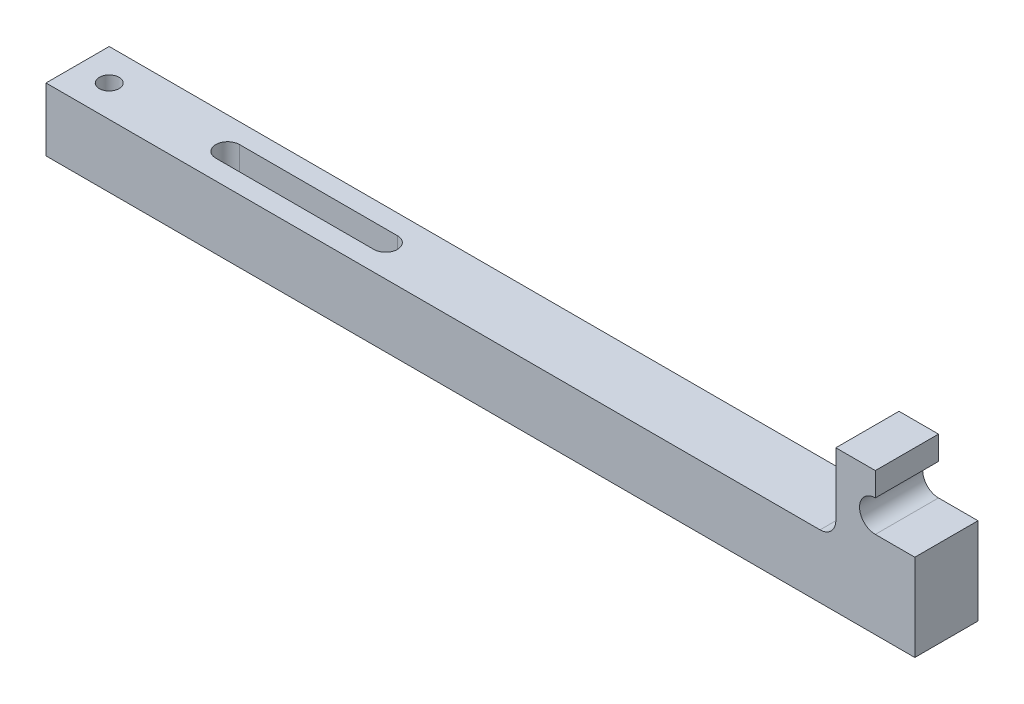
ISO-10303-21;
HEADER;
FILE_DESCRIPTION(('STEP AP214'),'2;1');
FILE_NAME('part.step','',(''),(''),'','','');
FILE_SCHEMA(('AUTOMOTIVE_DESIGN { 1 0 10303 214 1 1 1 1 }'));
ENDSEC;
DATA;
#1=APPLICATION_CONTEXT('core data for automotive mechanical design processes');
#2=APPLICATION_PROTOCOL_DEFINITION('international standard','automotive_design',2000,#1);
#3=PRODUCT_CONTEXT('',#1,'mechanical');
#4=PRODUCT('Part','Part','',(#3));
#5=PRODUCT_RELATED_PRODUCT_CATEGORY('part','',(#4));
#6=PRODUCT_DEFINITION_FORMATION('','',#4);
#7=PRODUCT_DEFINITION_CONTEXT('part definition',#1,'design');
#8=PRODUCT_DEFINITION('design','',#6,#7);
#9=PRODUCT_DEFINITION_SHAPE('','',#8);
#10=(LENGTH_UNIT() NAMED_UNIT(*) SI_UNIT(.MILLI.,.METRE.));
#11=(NAMED_UNIT(*) PLANE_ANGLE_UNIT() SI_UNIT($,.RADIAN.));
#12=(NAMED_UNIT(*) SI_UNIT($,.STERADIAN.) SOLID_ANGLE_UNIT());
#13=UNCERTAINTY_MEASURE_WITH_UNIT(LENGTH_MEASURE(1.E-05),#10,'distance_accuracy_value','');
#14=(GEOMETRIC_REPRESENTATION_CONTEXT(3) GLOBAL_UNCERTAINTY_ASSIGNED_CONTEXT((#13)) GLOBAL_UNIT_ASSIGNED_CONTEXT((#10,
#11,#12)) REPRESENTATION_CONTEXT('',''));
#15=CARTESIAN_POINT('',(0.,0.,0.));
#16=DIRECTION('',(0.,0.,1.));
#17=DIRECTION('',(1.,0.,0.));
#18=AXIS2_PLACEMENT_3D('',#15,#16,#17);
#19=CARTESIAN_POINT('',(-36.5317519078392,6.05177560888821,8.));
#20=DIRECTION('',(0.,0.,-1.));
#21=DIRECTION('',(-1.,0.,0.));
#22=AXIS2_PLACEMENT_3D('',#19,#20,#21);
#23=CYLINDRICAL_SURFACE('',#22,2.);
#24=CARTESIAN_POINT('',(-36.5317519078392,6.05177560888821,0.));
#25=DIRECTION('',(0.,0.,-1.));
#26=DIRECTION('',(1.,0.,0.));
#27=AXIS2_PLACEMENT_3D('',#24,#25,#26);
#28=CIRCLE('',#27,2.);
#29=CARTESIAN_POINT('',(-34.5317519078392,6.05177560888821,0.));
#30=VERTEX_POINT('',#29);
#31=CARTESIAN_POINT('',(-36.5317519078392,4.05177560888821,0.));
#32=VERTEX_POINT('',#31);
#33=EDGE_CURVE('E173',#30,#32,#28,.T.);
#34=ORIENTED_EDGE('',*,*,#33,.T.);
#35=DIRECTION('',(0.,0.,-1.));
#36=VECTOR('',#35,1.);
#37=CARTESIAN_POINT('',(-36.5317519078392,4.05177560888821,8.));
#38=LINE('',#37,#36);
#39=CARTESIAN_POINT('',(-36.5317519078392,4.05177560888821,8.));
#40=VERTEX_POINT('',#39);
#41=EDGE_CURVE('E11',#40,#32,#38,.T.);
#42=ORIENTED_EDGE('',*,*,#41,.F.);
#43=CARTESIAN_POINT('',(-36.5317519078392,6.05177560888821,8.));
#44=DIRECTION('',(0.,0.,-1.));
#45=DIRECTION('',(1.,0.,0.));
#46=AXIS2_PLACEMENT_3D('',#43,#44,#45);
#47=CIRCLE('',#46,2.);
#48=CARTESIAN_POINT('',(-34.5317519078392,6.05177560888821,8.));
#49=VERTEX_POINT('',#48);
#50=EDGE_CURVE('E176',#49,#40,#47,.T.);
#51=ORIENTED_EDGE('',*,*,#50,.F.);
#52=DIRECTION('',(0.,0.,-1.));
#53=VECTOR('',#52,1.);
#54=CARTESIAN_POINT('',(-34.5317519078392,6.05177560888821,8.));
#55=LINE('',#54,#53);
#56=EDGE_CURVE('E198',#49,#30,#55,.T.);
#57=ORIENTED_EDGE('',*,*,#56,.T.);
#58=EDGE_LOOP('',(#34,#42,#51,#57));
#59=FACE_BOUND('',#58,.T.);
#60=ADVANCED_FACE('F33',(#59),#23,.F.);
#61=CARTESIAN_POINT('',(-134.531751907839,4.05177560888821,8.));
#62=DIRECTION('',(0.,-1.,0.));
#63=DIRECTION('',(0.,0.,-1.));
#64=AXIS2_PLACEMENT_3D('',#61,#62,#63);
#65=PLANE('',#64);
#66=DIRECTION('',(1.,0.,0.));
#67=VECTOR('',#66,1.);
#68=CARTESIAN_POINT('',(-115.531751907839,4.05177560888821,5.5));
#69=LINE('',#68,#67);
#70=CARTESIAN_POINT('',(-115.531751907839,4.05177560888821,5.5));
#71=VERTEX_POINT('',#70);
#72=CARTESIAN_POINT('',(-95.5317519078392,4.05177560888821,5.5));
#73=VERTEX_POINT('',#72);
#74=EDGE_CURVE('E160',#71,#73,#69,.T.);
#75=ORIENTED_EDGE('',*,*,#74,.F.);
#76=CARTESIAN_POINT('',(-115.531751907839,4.05177560888821,4.));
#77=DIRECTION('',(0.,1.,0.));
#78=DIRECTION('',(0.,0.,1.));
#79=AXIS2_PLACEMENT_3D('',#76,#77,#78);
#80=CIRCLE('',#79,1.5);
#81=CARTESIAN_POINT('',(-115.531751907839,4.05177560888821,2.5));
#82=VERTEX_POINT('',#81);
#83=EDGE_CURVE('E47',#82,#71,#80,.T.);
#84=ORIENTED_EDGE('',*,*,#83,.F.);
#85=DIRECTION('',(-1.,0.,0.));
#86=VECTOR('',#85,1.);
#87=CARTESIAN_POINT('',(-115.531751907839,4.05177560888821,2.5));
#88=LINE('',#87,#86);
#89=CARTESIAN_POINT('',(-95.5317519078392,4.05177560888821,2.5));
#90=VERTEX_POINT('',#89);
#91=EDGE_CURVE('E151',#90,#82,#88,.T.);
#92=ORIENTED_EDGE('',*,*,#91,.F.);
#93=CARTESIAN_POINT('',(-95.5317519078392,4.05177560888821,4.));
#94=DIRECTION('',(0.,1.,0.));
#95=DIRECTION('',(0.,0.,1.));
#96=AXIS2_PLACEMENT_3D('',#93,#94,#95);
#97=CIRCLE('',#96,1.5);
#98=EDGE_CURVE('E154',#73,#90,#97,.T.);
#99=ORIENTED_EDGE('',*,*,#98,.F.);
#100=EDGE_LOOP('',(#75,#84,#92,#99));
#101=FACE_BOUND('',#100,.T.);
#102=CARTESIAN_POINT('',(-130.531751907839,4.05177560888821,4.));
#103=DIRECTION('',(0.,1.,0.));
#104=DIRECTION('',(0.,0.,1.));
#105=AXIS2_PLACEMENT_3D('',#102,#103,#104);
#106=CIRCLE('',#105,1.25000000000001);
#107=CARTESIAN_POINT('',(-130.531751907839,4.05177560888821,5.25000000000001));
#108=VERTEX_POINT('',#107);
#109=EDGE_CURVE('E166',#108,#108,#106,.T.);
#110=ORIENTED_EDGE('',*,*,#109,.F.);
#111=EDGE_LOOP('',(#110));
#112=FACE_BOUND('',#111,.T.);
#113=DIRECTION('',(-1.,0.,0.));
#114=VECTOR('',#113,1.);
#115=CARTESIAN_POINT('',(-134.531751907839,4.05177560888821,0.));
#116=LINE('',#115,#114);
#117=CARTESIAN_POINT('',(-134.531751907839,4.05177560888821,0.));
#118=VERTEX_POINT('',#117);
#119=EDGE_CURVE('E201',#32,#118,#116,.T.);
#120=ORIENTED_EDGE('',*,*,#119,.T.);
#121=DIRECTION('',(0.,0.,-1.));
#122=VECTOR('',#121,1.);
#123=CARTESIAN_POINT('',(-134.531751907839,4.05177560888821,8.));
#124=LINE('',#123,#122);
#125=CARTESIAN_POINT('',(-134.531751907839,4.05177560888821,8.));
#126=VERTEX_POINT('',#125);
#127=EDGE_CURVE('E40',#126,#118,#124,.T.);
#128=ORIENTED_EDGE('',*,*,#127,.F.);
#129=DIRECTION('',(-1.,0.,0.));
#130=VECTOR('',#129,1.);
#131=CARTESIAN_POINT('',(-134.531751907839,4.05177560888821,8.));
#132=LINE('',#131,#130);
#133=EDGE_CURVE('E179',#40,#126,#132,.T.);
#134=ORIENTED_EDGE('',*,*,#133,.F.);
#135=ORIENTED_EDGE('',*,*,#41,.T.);
#136=EDGE_LOOP('',(#120,#128,#134,#135));
#137=FACE_BOUND('',#136,.T.);
#138=ADVANCED_FACE('F267',(#101,#112,#137),#65,.F.);
#139=CARTESIAN_POINT('',(-134.531751907839,-3.9482243911118,8.));
#140=DIRECTION('',(1.,0.,0.));
#141=DIRECTION('',(0.,0.,-1.));
#142=AXIS2_PLACEMENT_3D('',#139,#140,#141);
#143=PLANE('',#142);
#144=DIRECTION('',(0.,-1.,0.));
#145=VECTOR('',#144,1.);
#146=CARTESIAN_POINT('',(-134.531751907839,-3.9482243911118,0.));
#147=LINE('',#146,#145);
#148=CARTESIAN_POINT('',(-134.531751907839,-3.9482243911118,0.));
#149=VERTEX_POINT('',#148);
#150=EDGE_CURVE('E203',#118,#149,#147,.T.);
#151=ORIENTED_EDGE('',*,*,#150,.T.);
#152=DIRECTION('',(0.,0.,-1.));
#153=VECTOR('',#152,1.);
#154=CARTESIAN_POINT('',(-134.531751907839,-3.9482243911118,8.));
#155=LINE('',#154,#153);
#156=CARTESIAN_POINT('',(-134.531751907839,-3.9482243911118,8.));
#157=VERTEX_POINT('',#156);
#158=EDGE_CURVE('E238',#157,#149,#155,.T.);
#159=ORIENTED_EDGE('',*,*,#158,.F.);
#160=DIRECTION('',(0.,-1.,0.));
#161=VECTOR('',#160,1.);
#162=CARTESIAN_POINT('',(-134.531751907839,-3.9482243911118,8.));
#163=LINE('',#162,#161);
#164=EDGE_CURVE('E182',#126,#157,#163,.T.);
#165=ORIENTED_EDGE('',*,*,#164,.F.);
#166=ORIENTED_EDGE('',*,*,#127,.T.);
#167=EDGE_LOOP('',(#151,#159,#165,#166));
#168=FACE_BOUND('',#167,.T.);
#169=ADVANCED_FACE('F245',(#168),#143,.F.);
#170=CARTESIAN_POINT('',(-24.5317519078392,-3.94822439111179,8.));
#171=DIRECTION('',(0.,1.,0.));
#172=DIRECTION('',(-1.,0.,0.));
#173=AXIS2_PLACEMENT_3D('',#170,#171,#172);
#174=PLANE('',#173);
#175=DIRECTION('',(-1.,0.,0.));
#176=VECTOR('',#175,1.);
#177=CARTESIAN_POINT('',(-115.531751907839,-3.94822439111179,2.5));
#178=LINE('',#177,#176);
#179=CARTESIAN_POINT('',(-95.5317519078392,-3.94822439111179,2.5));
#180=VERTEX_POINT('',#179);
#181=CARTESIAN_POINT('',(-115.531751907839,-3.94822439111179,2.5));
#182=VERTEX_POINT('',#181);
#183=EDGE_CURVE('E141',#180,#182,#178,.T.);
#184=ORIENTED_EDGE('',*,*,#183,.T.);
#185=CARTESIAN_POINT('',(-115.531751907839,-3.94822439111179,4.));
#186=DIRECTION('',(0.,1.,0.));
#187=DIRECTION('',(0.,0.,1.));
#188=AXIS2_PLACEMENT_3D('',#185,#186,#187);
#189=CIRCLE('',#188,1.5);
#190=CARTESIAN_POINT('',(-115.531751907839,-3.94822439111179,5.5));
#191=VERTEX_POINT('',#190);
#192=EDGE_CURVE('E135',#182,#191,#189,.T.);
#193=ORIENTED_EDGE('',*,*,#192,.T.);
#194=DIRECTION('',(1.,0.,0.));
#195=VECTOR('',#194,1.);
#196=CARTESIAN_POINT('',(-115.531751907839,-3.94822439111179,5.5));
#197=LINE('',#196,#195);
#198=CARTESIAN_POINT('',(-95.5317519078392,-3.9482243911118,5.5));
#199=VERTEX_POINT('',#198);
#200=EDGE_CURVE('E144',#191,#199,#197,.T.);
#201=ORIENTED_EDGE('',*,*,#200,.T.);
#202=CARTESIAN_POINT('',(-95.5317519078392,-3.94822439111179,4.));
#203=DIRECTION('',(0.,1.,0.));
#204=DIRECTION('',(0.,0.,1.));
#205=AXIS2_PLACEMENT_3D('',#202,#203,#204);
#206=CIRCLE('',#205,1.5);
#207=EDGE_CURVE('E55',#199,#180,#206,.T.);
#208=ORIENTED_EDGE('',*,*,#207,.T.);
#209=EDGE_LOOP('',(#184,#193,#201,#208));
#210=FACE_BOUND('',#209,.T.);
#211=CARTESIAN_POINT('',(-130.531751907839,-3.94822439111179,4.));
#212=DIRECTION('',(0.,1.,0.));
#213=DIRECTION('',(0.,0.,1.));
#214=AXIS2_PLACEMENT_3D('',#211,#212,#213);
#215=CIRCLE('',#214,1.25000000000001);
#216=CARTESIAN_POINT('',(-130.531751907839,-3.94822439111179,5.25000000000001));
#217=VERTEX_POINT('',#216);
#218=EDGE_CURVE('E170',#217,#217,#215,.T.);
#219=ORIENTED_EDGE('',*,*,#218,.T.);
#220=EDGE_LOOP('',(#219));
#221=FACE_BOUND('',#220,.T.);
#222=DIRECTION('',(1.,0.,0.));
#223=VECTOR('',#222,1.);
#224=CARTESIAN_POINT('',(-24.5317519078392,-3.94822439111179,0.));
#225=LINE('',#224,#223);
#226=CARTESIAN_POINT('',(-24.5317519078392,-3.94822439111179,0.));
#227=VERTEX_POINT('',#226);
#228=EDGE_CURVE('E205',#149,#227,#225,.T.);
#229=ORIENTED_EDGE('',*,*,#228,.T.);
#230=DIRECTION('',(0.,0.,-1.));
#231=VECTOR('',#230,1.);
#232=CARTESIAN_POINT('',(-24.5317519078392,-3.94822439111179,8.));
#233=LINE('',#232,#231);
#234=CARTESIAN_POINT('',(-24.5317519078392,-3.94822439111179,8.));
#235=VERTEX_POINT('',#234);
#236=EDGE_CURVE('E235',#235,#227,#233,.T.);
#237=ORIENTED_EDGE('',*,*,#236,.F.);
#238=DIRECTION('',(1.,0.,0.));
#239=VECTOR('',#238,1.);
#240=CARTESIAN_POINT('',(-24.5317519078392,-3.94822439111179,8.));
#241=LINE('',#240,#239);
#242=EDGE_CURVE('E184',#157,#235,#241,.T.);
#243=ORIENTED_EDGE('',*,*,#242,.F.);
#244=ORIENTED_EDGE('',*,*,#158,.T.);
#245=EDGE_LOOP('',(#229,#237,#243,#244));
#246=FACE_BOUND('',#245,.T.);
#247=ADVANCED_FACE('F148',(#210,#221,#246),#174,.F.);
#248=CARTESIAN_POINT('',(-24.5317519078392,7.05177560888821,8.));
#249=DIRECTION('',(-1.,0.,0.));
#250=DIRECTION('',(0.,0.,1.));
#251=AXIS2_PLACEMENT_3D('',#248,#249,#250);
#252=PLANE('',#251);
#253=DIRECTION('',(0.,1.,0.));
#254=VECTOR('',#253,1.);
#255=CARTESIAN_POINT('',(-24.5317519078392,7.05177560888821,0.));
#256=LINE('',#255,#254);
#257=CARTESIAN_POINT('',(-24.5317519078392,7.05177560888821,0.));
#258=VERTEX_POINT('',#257);
#259=EDGE_CURVE('E207',#227,#258,#256,.T.);
#260=ORIENTED_EDGE('',*,*,#259,.T.);
#261=DIRECTION('',(0.,0.,-1.));
#262=VECTOR('',#261,1.);
#263=CARTESIAN_POINT('',(-24.5317519078392,7.05177560888821,8.));
#264=LINE('',#263,#262);
#265=CARTESIAN_POINT('',(-24.5317519078392,7.05177560888821,8.));
#266=VERTEX_POINT('',#265);
#267=EDGE_CURVE('E232',#266,#258,#264,.T.);
#268=ORIENTED_EDGE('',*,*,#267,.F.);
#269=DIRECTION('',(0.,1.,0.));
#270=VECTOR('',#269,1.);
#271=CARTESIAN_POINT('',(-24.5317519078392,7.05177560888821,8.));
#272=LINE('',#271,#270);
#273=EDGE_CURVE('E186',#235,#266,#272,.T.);
#274=ORIENTED_EDGE('',*,*,#273,.F.);
#275=ORIENTED_EDGE('',*,*,#236,.T.);
#276=EDGE_LOOP('',(#260,#268,#274,#275));
#277=FACE_BOUND('',#276,.T.);
#278=ADVANCED_FACE('F259',(#277),#252,.F.);
#279=CARTESIAN_POINT('',(-29.5317519078392,7.05177560888821,8.));
#280=DIRECTION('',(0.,-1.,0.));
#281=DIRECTION('',(0.,0.,-1.));
#282=AXIS2_PLACEMENT_3D('',#279,#280,#281);
#283=PLANE('',#282);
#284=DIRECTION('',(-1.,0.,0.));
#285=VECTOR('',#284,1.);
#286=CARTESIAN_POINT('',(-29.5317519078392,7.05177560888821,0.));
#287=LINE('',#286,#285);
#288=CARTESIAN_POINT('',(-29.5317519078392,7.05177560888821,0.));
#289=VERTEX_POINT('',#288);
#290=EDGE_CURVE('E209',#258,#289,#287,.T.);
#291=ORIENTED_EDGE('',*,*,#290,.T.);
#292=DIRECTION('',(0.,0.,-1.));
#293=VECTOR('',#292,1.);
#294=CARTESIAN_POINT('',(-29.5317519078392,7.05177560888821,8.));
#295=LINE('',#294,#293);
#296=CARTESIAN_POINT('',(-29.5317519078392,7.05177560888821,8.));
#297=VERTEX_POINT('',#296);
#298=EDGE_CURVE('E229',#297,#289,#295,.T.);
#299=ORIENTED_EDGE('',*,*,#298,.F.);
#300=DIRECTION('',(-1.,0.,0.));
#301=VECTOR('',#300,1.);
#302=CARTESIAN_POINT('',(-29.5317519078392,7.05177560888821,8.));
#303=LINE('',#302,#301);
#304=EDGE_CURVE('E188',#266,#297,#303,.T.);
#305=ORIENTED_EDGE('',*,*,#304,.F.);
#306=ORIENTED_EDGE('',*,*,#267,.T.);
#307=EDGE_LOOP('',(#291,#299,#305,#306));
#308=FACE_BOUND('',#307,.T.);
#309=ADVANCED_FACE('F290',(#308),#283,.F.);
#310=CARTESIAN_POINT('',(-29.5317519078392,9.05177560888821,8.));
#311=DIRECTION('',(0.,0.,-1.));
#312=DIRECTION('',(-1.,0.,0.));
#313=AXIS2_PLACEMENT_3D('',#310,#311,#312);
#314=CYLINDRICAL_SURFACE('',#313,2.);
#315=CARTESIAN_POINT('',(-29.5317519078392,9.05177560888821,0.));
#316=DIRECTION('',(0.,0.,-1.));
#317=DIRECTION('',(1.,0.,0.));
#318=AXIS2_PLACEMENT_3D('',#315,#316,#317);
#319=CIRCLE('',#318,2.);
#320=CARTESIAN_POINT('',(-29.5317519078392,11.0517756088882,0.));
#321=VERTEX_POINT('',#320);
#322=EDGE_CURVE('E211',#289,#321,#319,.T.);
#323=ORIENTED_EDGE('',*,*,#322,.T.);
#324=DIRECTION('',(0.,0.,-1.));
#325=VECTOR('',#324,1.);
#326=CARTESIAN_POINT('',(-29.5317519078392,11.0517756088882,8.));
#327=LINE('',#326,#325);
#328=CARTESIAN_POINT('',(-29.5317519078392,11.0517756088882,8.));
#329=VERTEX_POINT('',#328);
#330=EDGE_CURVE('E226',#329,#321,#327,.T.);
#331=ORIENTED_EDGE('',*,*,#330,.F.);
#332=CARTESIAN_POINT('',(-29.5317519078392,9.05177560888821,8.));
#333=DIRECTION('',(0.,0.,-1.));
#334=DIRECTION('',(1.,0.,0.));
#335=AXIS2_PLACEMENT_3D('',#332,#333,#334);
#336=CIRCLE('',#335,2.);
#337=EDGE_CURVE('E190',#297,#329,#336,.T.);
#338=ORIENTED_EDGE('',*,*,#337,.F.);
#339=ORIENTED_EDGE('',*,*,#298,.T.);
#340=EDGE_LOOP('',(#323,#331,#338,#339));
#341=FACE_BOUND('',#340,.T.);
#342=ADVANCED_FACE('F287',(#341),#314,.F.);
#343=CARTESIAN_POINT('',(-29.5317519078392,11.0517756088882,8.));
#344=DIRECTION('',(-1.,0.,0.));
#345=DIRECTION('',(0.,0.,1.));
#346=AXIS2_PLACEMENT_3D('',#343,#344,#345);
#347=PLANE('',#346);
#348=DIRECTION('',(0.,1.,0.));
#349=VECTOR('',#348,1.);
#350=CARTESIAN_POINT('',(-29.5317519078392,11.0517756088882,0.));
#351=LINE('',#350,#349);
#352=CARTESIAN_POINT('',(-29.5317519078392,14.0517756088882,0.));
#353=VERTEX_POINT('',#352);
#354=EDGE_CURVE('E213',#321,#353,#351,.T.);
#355=ORIENTED_EDGE('',*,*,#354,.T.);
#356=DIRECTION('',(0.,0.,-1.));
#357=VECTOR('',#356,1.);
#358=CARTESIAN_POINT('',(-29.5317519078392,14.0517756088882,8.));
#359=LINE('',#358,#357);
#360=CARTESIAN_POINT('',(-29.5317519078392,14.0517756088882,8.));
#361=VERTEX_POINT('',#360);
#362=EDGE_CURVE('E223',#361,#353,#359,.T.);
#363=ORIENTED_EDGE('',*,*,#362,.F.);
#364=DIRECTION('',(0.,1.,0.));
#365=VECTOR('',#364,1.);
#366=CARTESIAN_POINT('',(-29.5317519078392,11.0517756088882,8.));
#367=LINE('',#366,#365);
#368=EDGE_CURVE('E192',#329,#361,#367,.T.);
#369=ORIENTED_EDGE('',*,*,#368,.F.);
#370=ORIENTED_EDGE('',*,*,#330,.T.);
#371=EDGE_LOOP('',(#355,#363,#369,#370));
#372=FACE_BOUND('',#371,.T.);
#373=ADVANCED_FACE('F283',(#372),#347,.F.);
#374=CARTESIAN_POINT('',(-29.5317519078392,14.0517756088882,8.));
#375=DIRECTION('',(0.,-1.,0.));
#376=DIRECTION('',(0.,0.,-1.));
#377=AXIS2_PLACEMENT_3D('',#374,#375,#376);
#378=PLANE('',#377);
#379=DIRECTION('',(-1.,0.,0.));
#380=VECTOR('',#379,1.);
#381=CARTESIAN_POINT('',(-29.5317519078392,14.0517756088882,0.));
#382=LINE('',#381,#380);
#383=CARTESIAN_POINT('',(-34.5317519078392,14.0517756088882,0.));
#384=VERTEX_POINT('',#383);
#385=EDGE_CURVE('E215',#353,#384,#382,.T.);
#386=ORIENTED_EDGE('',*,*,#385,.T.);
#387=DIRECTION('',(0.,0.,-1.));
#388=VECTOR('',#387,1.);
#389=CARTESIAN_POINT('',(-34.5317519078392,14.0517756088882,8.));
#390=LINE('',#389,#388);
#391=CARTESIAN_POINT('',(-34.5317519078392,14.0517756088882,8.));
#392=VERTEX_POINT('',#391);
#393=EDGE_CURVE('E220',#392,#384,#390,.T.);
#394=ORIENTED_EDGE('',*,*,#393,.F.);
#395=DIRECTION('',(-1.,0.,0.));
#396=VECTOR('',#395,1.);
#397=CARTESIAN_POINT('',(-29.5317519078392,14.0517756088882,8.));
#398=LINE('',#397,#396);
#399=EDGE_CURVE('E194',#361,#392,#398,.T.);
#400=ORIENTED_EDGE('',*,*,#399,.F.);
#401=ORIENTED_EDGE('',*,*,#362,.T.);
#402=EDGE_LOOP('',(#386,#394,#400,#401));
#403=FACE_BOUND('',#402,.T.);
#404=ADVANCED_FACE('F279',(#403),#378,.F.);
#405=CARTESIAN_POINT('',(-34.5317519078392,14.0517756088882,8.));
#406=DIRECTION('',(1.,0.,0.));
#407=DIRECTION('',(0.,0.,-1.));
#408=AXIS2_PLACEMENT_3D('',#405,#406,#407);
#409=PLANE('',#408);
#410=DIRECTION('',(0.,-1.,0.));
#411=VECTOR('',#410,1.);
#412=CARTESIAN_POINT('',(-34.5317519078392,14.0517756088882,0.));
#413=LINE('',#412,#411);
#414=EDGE_CURVE('E180',#384,#30,#413,.T.);
#415=ORIENTED_EDGE('',*,*,#414,.T.);
#416=ORIENTED_EDGE('',*,*,#56,.F.);
#417=DIRECTION('',(0.,-1.,0.));
#418=VECTOR('',#417,1.);
#419=CARTESIAN_POINT('',(-34.5317519078392,14.0517756088882,8.));
#420=LINE('',#419,#418);
#421=EDGE_CURVE('E196',#392,#49,#420,.T.);
#422=ORIENTED_EDGE('',*,*,#421,.F.);
#423=ORIENTED_EDGE('',*,*,#393,.T.);
#424=EDGE_LOOP('',(#415,#416,#422,#423));
#425=FACE_BOUND('',#424,.T.);
#426=ADVANCED_FACE('F274',(#425),#409,.F.);
#427=CARTESIAN_POINT('',(-36.5317519078392,6.05177560888821,8.));
#428=DIRECTION('',(0.,0.,1.));
#429=DIRECTION('',(1.,0.,0.));
#430=AXIS2_PLACEMENT_3D('',#427,#428,#429);
#431=PLANE('',#430);
#432=ORIENTED_EDGE('',*,*,#50,.T.);
#433=ORIENTED_EDGE('',*,*,#133,.T.);
#434=ORIENTED_EDGE('',*,*,#164,.T.);
#435=ORIENTED_EDGE('',*,*,#242,.T.);
#436=ORIENTED_EDGE('',*,*,#273,.T.);
#437=ORIENTED_EDGE('',*,*,#304,.T.);
#438=ORIENTED_EDGE('',*,*,#337,.T.);
#439=ORIENTED_EDGE('',*,*,#368,.T.);
#440=ORIENTED_EDGE('',*,*,#399,.T.);
#441=ORIENTED_EDGE('',*,*,#421,.T.);
#442=EDGE_LOOP('',(#432,#433,#434,#435,#436,#437,#438,#439,#440,#441));
#443=FACE_BOUND('',#442,.T.);
#444=ADVANCED_FACE('F263',(#443),#431,.T.);
#445=CARTESIAN_POINT('',(-36.5317519078392,6.05177560888821,0.));
#446=DIRECTION('',(0.,0.,1.));
#447=DIRECTION('',(1.,0.,0.));
#448=AXIS2_PLACEMENT_3D('',#445,#446,#447);
#449=PLANE('',#448);
#450=ORIENTED_EDGE('',*,*,#33,.F.);
#451=ORIENTED_EDGE('',*,*,#414,.F.);
#452=ORIENTED_EDGE('',*,*,#385,.F.);
#453=ORIENTED_EDGE('',*,*,#354,.F.);
#454=ORIENTED_EDGE('',*,*,#322,.F.);
#455=ORIENTED_EDGE('',*,*,#290,.F.);
#456=ORIENTED_EDGE('',*,*,#259,.F.);
#457=ORIENTED_EDGE('',*,*,#228,.F.);
#458=ORIENTED_EDGE('',*,*,#150,.F.);
#459=ORIENTED_EDGE('',*,*,#119,.F.);
#460=EDGE_LOOP('',(#450,#451,#452,#453,#454,#455,#456,#457,#458,#459));
#461=FACE_BOUND('',#460,.T.);
#462=ADVANCED_FACE('F251',(#461),#449,.F.);
#463=CARTESIAN_POINT('',(-130.531751907839,-3.94822439111179,4.));
#464=DIRECTION('',(0.,1.,0.));
#465=DIRECTION('',(0.,0.,1.));
#466=AXIS2_PLACEMENT_3D('',#463,#464,#465);
#467=CYLINDRICAL_SURFACE('',#466,1.25000000000001);
#468=ORIENTED_EDGE('',*,*,#218,.F.);
#469=EDGE_LOOP('',(#468));
#470=FACE_BOUND('',#469,.T.);
#471=ORIENTED_EDGE('',*,*,#109,.T.);
#472=EDGE_LOOP('',(#471));
#473=FACE_BOUND('',#472,.T.);
#474=ADVANCED_FACE('F373',(#470,#473),#467,.F.);
#475=CARTESIAN_POINT('',(-115.531751907839,-3.94822439111179,4.));
#476=DIRECTION('',(0.,1.,0.));
#477=DIRECTION('',(0.,0.,1.));
#478=AXIS2_PLACEMENT_3D('',#475,#476,#477);
#479=CYLINDRICAL_SURFACE('',#478,1.5);
#480=ORIENTED_EDGE('',*,*,#83,.T.);
#481=DIRECTION('',(0.,1.,0.));
#482=VECTOR('',#481,1.);
#483=CARTESIAN_POINT('',(-115.531751907839,-3.94822439111179,5.5));
#484=LINE('',#483,#482);
#485=EDGE_CURVE('E131',#191,#71,#484,.T.);
#486=ORIENTED_EDGE('',*,*,#485,.F.);
#487=ORIENTED_EDGE('',*,*,#192,.F.);
#488=DIRECTION('',(0.,1.,0.));
#489=VECTOR('',#488,1.);
#490=CARTESIAN_POINT('',(-115.531751907839,-3.94822439111179,2.5));
#491=LINE('',#490,#489);
#492=EDGE_CURVE('E164',#182,#82,#491,.T.);
#493=ORIENTED_EDGE('',*,*,#492,.T.);
#494=EDGE_LOOP('',(#480,#486,#487,#493));
#495=FACE_BOUND('',#494,.T.);
#496=ADVANCED_FACE('F133',(#495),#479,.F.);
#497=CARTESIAN_POINT('',(-115.531751907839,-3.94822439111179,2.5));
#498=DIRECTION('',(0.,0.,-1.));
#499=DIRECTION('',(-1.,0.,0.));
#500=AXIS2_PLACEMENT_3D('',#497,#498,#499);
#501=PLANE('',#500);
#502=ORIENTED_EDGE('',*,*,#91,.T.);
#503=ORIENTED_EDGE('',*,*,#492,.F.);
#504=ORIENTED_EDGE('',*,*,#183,.F.);
#505=DIRECTION('',(0.,1.,0.));
#506=VECTOR('',#505,1.);
#507=CARTESIAN_POINT('',(-95.5317519078392,-3.94822439111179,2.5));
#508=LINE('',#507,#506);
#509=EDGE_CURVE('E167',#180,#90,#508,.T.);
#510=ORIENTED_EDGE('',*,*,#509,.T.);
#511=EDGE_LOOP('',(#502,#503,#504,#510));
#512=FACE_BOUND('',#511,.T.);
#513=ADVANCED_FACE('F402',(#512),#501,.F.);
#514=CARTESIAN_POINT('',(-95.5317519078392,-3.94822439111179,4.));
#515=DIRECTION('',(0.,1.,0.));
#516=DIRECTION('',(0.,0.,1.));
#517=AXIS2_PLACEMENT_3D('',#514,#515,#516);
#518=CYLINDRICAL_SURFACE('',#517,1.5);
#519=ORIENTED_EDGE('',*,*,#98,.T.);
#520=ORIENTED_EDGE('',*,*,#509,.F.);
#521=ORIENTED_EDGE('',*,*,#207,.F.);
#522=DIRECTION('',(0.,1.,0.));
#523=VECTOR('',#522,1.);
#524=CARTESIAN_POINT('',(-95.5317519078392,-3.94822439111179,5.5));
#525=LINE('',#524,#523);
#526=EDGE_CURVE('E140',#199,#73,#525,.T.);
#527=ORIENTED_EDGE('',*,*,#526,.T.);
#528=EDGE_LOOP('',(#519,#520,#521,#527));
#529=FACE_BOUND('',#528,.T.);
#530=ADVANCED_FACE('F408',(#529),#518,.F.);
#531=CARTESIAN_POINT('',(-115.531751907839,-3.94822439111179,5.5));
#532=DIRECTION('',(0.,0.,1.));
#533=DIRECTION('',(1.,0.,0.));
#534=AXIS2_PLACEMENT_3D('',#531,#532,#533);
#535=PLANE('',#534);
#536=ORIENTED_EDGE('',*,*,#74,.T.);
#537=ORIENTED_EDGE('',*,*,#526,.F.);
#538=ORIENTED_EDGE('',*,*,#200,.F.);
#539=ORIENTED_EDGE('',*,*,#485,.T.);
#540=EDGE_LOOP('',(#536,#537,#538,#539));
#541=FACE_BOUND('',#540,.T.);
#542=ADVANCED_FACE('F145',(#541),#535,.F.);
#543=CLOSED_SHELL('',(#60,#138,#169,#247,#278,#309,#342,#373,#404,#426,#444,#462,#474,#496,#513,
#530,#542));
#544=MANIFOLD_SOLID_BREP('B2',#543);
#545=ADVANCED_BREP_SHAPE_REPRESENTATION('',(#18,#544),#14);
#546=SHAPE_DEFINITION_REPRESENTATION(#9,#545);
ENDSEC;
END-ISO-10303-21;
